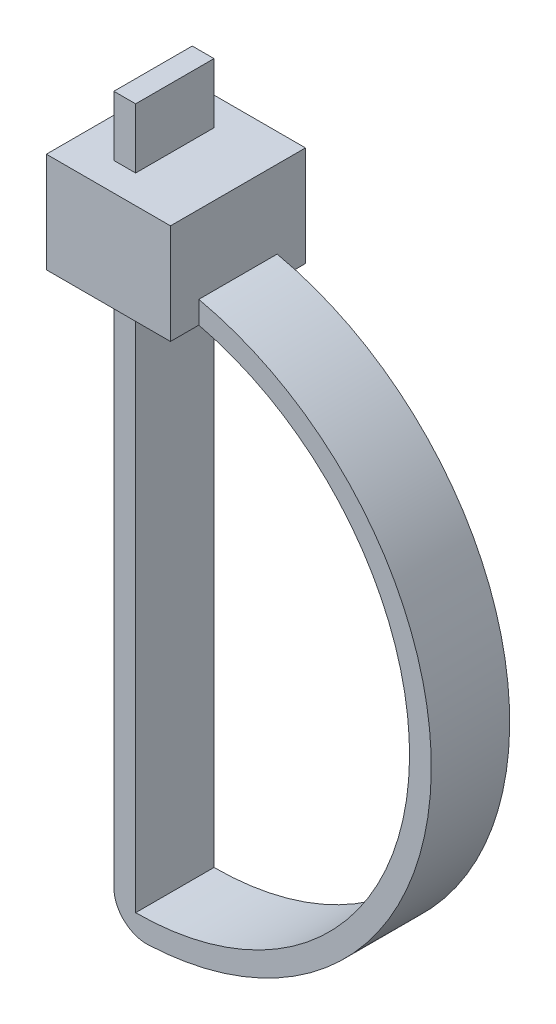
ISO-10303-21;
HEADER;
FILE_DESCRIPTION(('STEP AP214'),'2;1');
FILE_NAME('part.step','',(''),(''),'','','');
FILE_SCHEMA(('AUTOMOTIVE_DESIGN { 1 0 10303 214 1 1 1 1 }'));
ENDSEC;
DATA;
#1=APPLICATION_CONTEXT('core data for automotive mechanical design processes');
#2=APPLICATION_PROTOCOL_DEFINITION('international standard','automotive_design',2000,#1);
#3=PRODUCT_CONTEXT('',#1,'mechanical');
#4=PRODUCT('Part','Part','',(#3));
#5=PRODUCT_RELATED_PRODUCT_CATEGORY('part','',(#4));
#6=PRODUCT_DEFINITION_FORMATION('','',#4);
#7=PRODUCT_DEFINITION_CONTEXT('part definition',#1,'design');
#8=PRODUCT_DEFINITION('design','',#6,#7);
#9=PRODUCT_DEFINITION_SHAPE('','',#8);
#10=(LENGTH_UNIT() NAMED_UNIT(*) SI_UNIT(.MILLI.,.METRE.));
#11=(NAMED_UNIT(*) PLANE_ANGLE_UNIT() SI_UNIT($,.RADIAN.));
#12=(NAMED_UNIT(*) SI_UNIT($,.STERADIAN.) SOLID_ANGLE_UNIT());
#13=UNCERTAINTY_MEASURE_WITH_UNIT(LENGTH_MEASURE(1.E-05),#10,'distance_accuracy_value','');
#14=(GEOMETRIC_REPRESENTATION_CONTEXT(3) GLOBAL_UNCERTAINTY_ASSIGNED_CONTEXT((#13)) GLOBAL_UNIT_ASSIGNED_CONTEXT((#10,
#11,#12)) REPRESENTATION_CONTEXT('',''));
#15=CARTESIAN_POINT('',(0.,0.,0.));
#16=DIRECTION('',(0.,0.,1.));
#17=DIRECTION('',(1.,0.,0.));
#18=AXIS2_PLACEMENT_3D('',#15,#16,#17);
#19=CARTESIAN_POINT('',(-1.27,24.8841857478935,2.286));
#20=DIRECTION('',(0.,-1.,0.));
#21=DIRECTION('',(0.,0.,-1.));
#22=AXIS2_PLACEMENT_3D('',#19,#20,#21);
#23=PLANE('',#22);
#24=DIRECTION('',(0.,0.,-1.));
#25=VECTOR('',#24,1.);
#26=CARTESIAN_POINT('',(-1.27,24.8841857478935,2.286));
#27=LINE('',#26,#25);
#28=CARTESIAN_POINT('',(-1.27,24.8841857478935,-2.286));
#29=VERTEX_POINT('',#28);
#30=CARTESIAN_POINT('',(-1.27,24.8841857478935,2.286));
#31=VERTEX_POINT('',#30);
#32=EDGE_CURVE('E202',#29,#31,#27,.F.);
#33=ORIENTED_EDGE('',*,*,#32,.T.);
#34=DIRECTION('',(-1.,0.,0.));
#35=VECTOR('',#34,1.);
#36=CARTESIAN_POINT('',(0.,24.8841857478935,2.286));
#37=LINE('',#36,#35);
#38=CARTESIAN_POINT('',(0.,24.8841857478935,2.286));
#39=VERTEX_POINT('',#38);
#40=EDGE_CURVE('E240',#31,#39,#37,.F.);
#41=ORIENTED_EDGE('',*,*,#40,.T.);
#42=DIRECTION('',(0.,0.,1.));
#43=VECTOR('',#42,1.);
#44=CARTESIAN_POINT('',(0.,24.8841857478935,2.286));
#45=LINE('',#44,#43);
#46=CARTESIAN_POINT('',(0.,24.8841857478935,-2.286));
#47=VERTEX_POINT('',#46);
#48=EDGE_CURVE('E211',#39,#47,#45,.F.);
#49=ORIENTED_EDGE('',*,*,#48,.T.);
#50=DIRECTION('',(-1.,0.,0.));
#51=VECTOR('',#50,1.);
#52=CARTESIAN_POINT('',(0.,24.8841857478935,-2.286));
#53=LINE('',#52,#51);
#54=EDGE_CURVE('E214',#29,#47,#53,.F.);
#55=ORIENTED_EDGE('',*,*,#54,.F.);
#56=EDGE_LOOP('',(#33,#41,#49,#55));
#57=FACE_BOUND('',#56,.T.);
#58=ADVANCED_FACE('F17',(#57),#23,.F.);
#59=CARTESIAN_POINT('',(0.,0.,2.286));
#60=DIRECTION('',(0.,0.,-1.));
#61=DIRECTION('',(-1.,0.,0.));
#62=AXIS2_PLACEMENT_3D('',#59,#60,#61);
#63=PLANE('',#62);
#64=DIRECTION('',(-1.,0.,0.));
#65=VECTOR('',#64,1.);
#66=CARTESIAN_POINT('',(0.,21.388294045849,2.286));
#67=LINE('',#66,#65);
#68=CARTESIAN_POINT('',(0.,21.388294045849,2.286));
#69=VERTEX_POINT('',#68);
#70=CARTESIAN_POINT('',(-1.27,21.388294045849,2.286));
#71=VERTEX_POINT('',#70);
#72=EDGE_CURVE('E237',#69,#71,#67,.T.);
#73=ORIENTED_EDGE('',*,*,#72,.F.);
#74=DIRECTION('',(0.,1.,0.));
#75=VECTOR('',#74,1.);
#76=CARTESIAN_POINT('',(0.,18.0615659150551,2.286));
#77=LINE('',#76,#75);
#78=EDGE_CURVE('E205',#69,#39,#77,.T.);
#79=ORIENTED_EDGE('',*,*,#78,.T.);
#80=ORIENTED_EDGE('',*,*,#40,.F.);
#81=DIRECTION('',(0.,1.,0.));
#82=VECTOR('',#81,1.);
#83=CARTESIAN_POINT('',(-1.27,18.0615659150551,2.286));
#84=LINE('',#83,#82);
#85=EDGE_CURVE('E199',#31,#71,#84,.F.);
#86=ORIENTED_EDGE('',*,*,#85,.T.);
#87=EDGE_LOOP('',(#73,#79,#80,#86));
#88=FACE_BOUND('',#87,.T.);
#89=ADVANCED_FACE('F465',(#88),#63,.F.);
#90=CARTESIAN_POINT('',(0.,0.,-2.286));
#91=DIRECTION('',(0.,0.,-1.));
#92=DIRECTION('',(-1.,0.,0.));
#93=AXIS2_PLACEMENT_3D('',#90,#91,#92);
#94=PLANE('',#93);
#95=ORIENTED_EDGE('',*,*,#54,.T.);
#96=DIRECTION('',(0.,1.,0.));
#97=VECTOR('',#96,1.);
#98=CARTESIAN_POINT('',(0.,18.0615659150551,-2.286));
#99=LINE('',#98,#97);
#100=CARTESIAN_POINT('',(0.,21.388294045849,-2.286));
#101=VERTEX_POINT('',#100);
#102=EDGE_CURVE('E208',#47,#101,#99,.F.);
#103=ORIENTED_EDGE('',*,*,#102,.T.);
#104=DIRECTION('',(-1.,0.,0.));
#105=VECTOR('',#104,1.);
#106=CARTESIAN_POINT('',(0.,21.388294045849,-2.286));
#107=LINE('',#106,#105);
#108=CARTESIAN_POINT('',(-1.27,21.388294045849,-2.286));
#109=VERTEX_POINT('',#108);
#110=EDGE_CURVE('E234',#101,#109,#107,.T.);
#111=ORIENTED_EDGE('',*,*,#110,.T.);
#112=DIRECTION('',(0.,1.,0.));
#113=VECTOR('',#112,1.);
#114=CARTESIAN_POINT('',(-1.27,18.0615659150551,-2.286));
#115=LINE('',#114,#113);
#116=EDGE_CURVE('E196',#109,#29,#115,.T.);
#117=ORIENTED_EDGE('',*,*,#116,.T.);
#118=EDGE_LOOP('',(#95,#103,#111,#117));
#119=FACE_BOUND('',#118,.T.);
#120=ADVANCED_FACE('F455',(#119),#94,.T.);
#121=CARTESIAN_POINT('',(0.,18.0615659150551,2.286));
#122=DIRECTION('',(-1.,0.,0.));
#123=DIRECTION('',(0.,0.,1.));
#124=AXIS2_PLACEMENT_3D('',#121,#122,#123);
#125=PLANE('',#124);
#126=DIRECTION('',(0.,0.,-1.));
#127=VECTOR('',#126,1.);
#128=CARTESIAN_POINT('',(0.,21.388294045849,3.937));
#129=LINE('',#128,#127);
#130=EDGE_CURVE('E167',#69,#101,#129,.T.);
#131=ORIENTED_EDGE('',*,*,#130,.T.);
#132=ORIENTED_EDGE('',*,*,#102,.F.);
#133=ORIENTED_EDGE('',*,*,#48,.F.);
#134=ORIENTED_EDGE('',*,*,#78,.F.);
#135=EDGE_LOOP('',(#131,#132,#133,#134));
#136=FACE_BOUND('',#135,.T.);
#137=ADVANCED_FACE('F445',(#136),#125,.F.);
#138=CARTESIAN_POINT('',(-1.27,18.0615659150551,2.286));
#139=DIRECTION('',(1.,0.,0.));
#140=DIRECTION('',(0.,0.,-1.));
#141=AXIS2_PLACEMENT_3D('',#138,#139,#140);
#142=PLANE('',#141);
#143=DIRECTION('',(0.,0.,-1.));
#144=VECTOR('',#143,1.);
#145=CARTESIAN_POINT('',(-1.27,21.388294045849,3.937));
#146=LINE('',#145,#144);
#147=EDGE_CURVE('E164',#109,#71,#146,.F.);
#148=ORIENTED_EDGE('',*,*,#147,.T.);
#149=ORIENTED_EDGE('',*,*,#85,.F.);
#150=ORIENTED_EDGE('',*,*,#32,.F.);
#151=ORIENTED_EDGE('',*,*,#116,.F.);
#152=EDGE_LOOP('',(#148,#149,#150,#151));
#153=FACE_BOUND('',#152,.T.);
#154=ADVANCED_FACE('F436',(#153),#142,.F.);
#155=CARTESIAN_POINT('',(-3.556,15.546294045849,3.937));
#156=DIRECTION('',(1.,0.,0.));
#157=DIRECTION('',(0.,0.,-1.));
#158=AXIS2_PLACEMENT_3D('',#155,#156,#157);
#159=PLANE('',#158);
#160=DIRECTION('',(0.,0.,1.));
#161=VECTOR('',#160,1.);
#162=CARTESIAN_POINT('',(-3.556,15.546294045849,3.937));
#163=LINE('',#162,#161);
#164=CARTESIAN_POINT('',(-3.556,15.546294045849,-3.937));
#165=VERTEX_POINT('',#164);
#166=CARTESIAN_POINT('',(-3.556,15.546294045849,3.937));
#167=VERTEX_POINT('',#166);
#168=EDGE_CURVE('E103',#165,#167,#163,.T.);
#169=ORIENTED_EDGE('',*,*,#168,.T.);
#170=DIRECTION('',(0.,1.,0.));
#171=VECTOR('',#170,1.);
#172=CARTESIAN_POINT('',(-3.556,0.,3.937));
#173=LINE('',#172,#171);
#174=CARTESIAN_POINT('',(-3.556,21.388294045849,3.937));
#175=VERTEX_POINT('',#174);
#176=EDGE_CURVE('E176',#167,#175,#173,.T.);
#177=ORIENTED_EDGE('',*,*,#176,.T.);
#178=DIRECTION('',(0.,0.,-1.));
#179=VECTOR('',#178,1.);
#180=CARTESIAN_POINT('',(-3.556,21.388294045849,3.937));
#181=LINE('',#180,#179);
#182=CARTESIAN_POINT('',(-3.556,21.388294045849,-3.937));
#183=VERTEX_POINT('',#182);
#184=EDGE_CURVE('E170',#175,#183,#181,.T.);
#185=ORIENTED_EDGE('',*,*,#184,.T.);
#186=DIRECTION('',(0.,1.,0.));
#187=VECTOR('',#186,1.);
#188=CARTESIAN_POINT('',(-3.556,0.,-3.937));
#189=LINE('',#188,#187);
#190=EDGE_CURVE('E161',#165,#183,#189,.T.);
#191=ORIENTED_EDGE('',*,*,#190,.F.);
#192=EDGE_LOOP('',(#169,#177,#185,#191));
#193=FACE_BOUND('',#192,.T.);
#194=ADVANCED_FACE('F295',(#193),#159,.F.);
#195=CARTESIAN_POINT('',(0.635000000000004,15.3284528103785,2.286));
#196=DIRECTION('',(0.,0.,-1.));
#197=DIRECTION('',(-1.,0.,0.));
#198=AXIS2_PLACEMENT_3D('',#195,#196,#197);
#199=CYLINDRICAL_SURFACE('',#198,1.905);
#200=CARTESIAN_POINT('',(0.635000000000004,15.3284528103785,-2.286));
#201=DIRECTION('',(0.,0.,-1.));
#202=DIRECTION('',(-1.,0.,0.));
#203=AXIS2_PLACEMENT_3D('',#200,#201,#202);
#204=CIRCLE('',#203,1.905);
#205=CARTESIAN_POINT('',(-1.25750368457466,15.546294045849,-2.286));
#206=VERTEX_POINT('',#205);
#207=CARTESIAN_POINT('',(-1.27,15.3284528103785,-2.286));
#208=VERTEX_POINT('',#207);
#209=EDGE_CURVE('E101',#206,#208,#204,.F.);
#210=ORIENTED_EDGE('',*,*,#209,.T.);
#211=DIRECTION('',(0.,0.,-1.));
#212=VECTOR('',#211,1.);
#213=CARTESIAN_POINT('',(-1.27,15.3284528103785,2.286));
#214=LINE('',#213,#212);
#215=CARTESIAN_POINT('',(-1.27,15.3284528103785,2.286));
#216=VERTEX_POINT('',#215);
#217=EDGE_CURVE('E153',#208,#216,#214,.F.);
#218=ORIENTED_EDGE('',*,*,#217,.T.);
#219=CARTESIAN_POINT('',(0.635000000000004,15.3284528103785,2.286));
#220=DIRECTION('',(0.,0.,-1.));
#221=DIRECTION('',(-1.,0.,0.));
#222=AXIS2_PLACEMENT_3D('',#219,#220,#221);
#223=CIRCLE('',#222,1.905);
#224=CARTESIAN_POINT('',(-1.25750368457466,15.546294045849,2.286));
#225=VERTEX_POINT('',#224);
#226=EDGE_CURVE('E20',#216,#225,#223,.T.);
#227=ORIENTED_EDGE('',*,*,#226,.T.);
#228=DIRECTION('',(0.,0.,1.));
#229=VECTOR('',#228,1.);
#230=CARTESIAN_POINT('',(-1.25750368457466,15.546294045849,3.937));
#231=LINE('',#230,#229);
#232=EDGE_CURVE('E104',#225,#206,#231,.F.);
#233=ORIENTED_EDGE('',*,*,#232,.T.);
#234=EDGE_LOOP('',(#210,#218,#227,#233));
#235=FACE_BOUND('',#234,.T.);
#236=ADVANCED_FACE('F251',(#235),#199,.T.);
#237=CARTESIAN_POINT('',(-3.556,15.546294045849,3.937));
#238=DIRECTION('',(0.,1.,0.));
#239=DIRECTION('',(0.,0.,1.));
#240=AXIS2_PLACEMENT_3D('',#237,#238,#239);
#241=PLANE('',#240);
#242=DIRECTION('',(0.,0.,1.));
#243=VECTOR('',#242,1.);
#244=CARTESIAN_POINT('',(3.683,15.546294045849,3.937));
#245=LINE('',#244,#243);
#246=CARTESIAN_POINT('',(3.683,15.546294045849,-2.286));
#247=VERTEX_POINT('',#246);
#248=CARTESIAN_POINT('',(3.683,15.546294045849,-3.937));
#249=VERTEX_POINT('',#248);
#250=EDGE_CURVE('E188',#247,#249,#245,.F.);
#251=ORIENTED_EDGE('',*,*,#250,.F.);
#252=DIRECTION('',(0.,0.,-1.));
#253=VECTOR('',#252,1.);
#254=CARTESIAN_POINT('',(3.683,15.546294045849,2.286));
#255=LINE('',#254,#253);
#256=CARTESIAN_POINT('',(3.683,15.546294045849,2.286));
#257=VERTEX_POINT('',#256);
#258=EDGE_CURVE('E112',#247,#257,#255,.F.);
#259=ORIENTED_EDGE('',*,*,#258,.T.);
#260=DIRECTION('',(0.,0.,1.));
#261=VECTOR('',#260,1.);
#262=CARTESIAN_POINT('',(3.683,15.546294045849,3.937));
#263=LINE('',#262,#261);
#264=CARTESIAN_POINT('',(3.683,15.546294045849,3.937));
#265=VERTEX_POINT('',#264);
#266=EDGE_CURVE('E181',#265,#257,#263,.F.);
#267=ORIENTED_EDGE('',*,*,#266,.F.);
#268=DIRECTION('',(-1.,0.,0.));
#269=VECTOR('',#268,1.);
#270=CARTESIAN_POINT('',(0.,15.546294045849,3.937));
#271=LINE('',#270,#269);
#272=EDGE_CURVE('E179',#265,#167,#271,.T.);
#273=ORIENTED_EDGE('',*,*,#272,.T.);
#274=ORIENTED_EDGE('',*,*,#168,.F.);
#275=DIRECTION('',(-1.,0.,0.));
#276=VECTOR('',#275,1.);
#277=CARTESIAN_POINT('',(0.,15.546294045849,-3.937));
#278=LINE('',#277,#276);
#279=EDGE_CURVE('E157',#249,#165,#278,.T.);
#280=ORIENTED_EDGE('',*,*,#279,.F.);
#281=EDGE_LOOP('',(#251,#259,#267,#273,#274,#280));
#282=FACE_BOUND('',#281,.T.);
#283=DIRECTION('',(1.,0.,0.));
#284=VECTOR('',#283,1.);
#285=CARTESIAN_POINT('',(-3.556,15.546294045849,-2.286));
#286=LINE('',#285,#284);
#287=CARTESIAN_POINT('',(0.,15.546294045849,-2.286));
#288=VERTEX_POINT('',#287);
#289=EDGE_CURVE('E96',#206,#288,#286,.T.);
#290=ORIENTED_EDGE('',*,*,#289,.F.);
#291=ORIENTED_EDGE('',*,*,#232,.F.);
#292=DIRECTION('',(1.,0.,0.));
#293=VECTOR('',#292,1.);
#294=CARTESIAN_POINT('',(-3.556,15.546294045849,2.286));
#295=LINE('',#294,#293);
#296=CARTESIAN_POINT('',(0.,15.546294045849,2.286));
#297=VERTEX_POINT('',#296);
#298=EDGE_CURVE('E72',#297,#225,#295,.F.);
#299=ORIENTED_EDGE('',*,*,#298,.F.);
#300=DIRECTION('',(0.,0.,-1.));
#301=VECTOR('',#300,1.);
#302=CARTESIAN_POINT('',(0.,15.546294045849,2.286));
#303=LINE('',#302,#301);
#304=EDGE_CURVE('E106',#288,#297,#303,.F.);
#305=ORIENTED_EDGE('',*,*,#304,.F.);
#306=EDGE_LOOP('',(#290,#291,#299,#305));
#307=FACE_BOUND('',#306,.T.);
#308=ADVANCED_FACE('F107',(#282,#307),#241,.F.);
#309=CARTESIAN_POINT('',(0.,0.,3.937));
#310=DIRECTION('',(0.,0.,-1.));
#311=DIRECTION('',(-1.,0.,0.));
#312=AXIS2_PLACEMENT_3D('',#309,#310,#311);
#313=PLANE('',#312);
#314=ORIENTED_EDGE('',*,*,#272,.F.);
#315=DIRECTION('',(0.,1.,0.));
#316=VECTOR('',#315,1.);
#317=CARTESIAN_POINT('',(3.683,15.546294045849,3.937));
#318=LINE('',#317,#316);
#319=CARTESIAN_POINT('',(3.683,21.388294045849,3.937));
#320=VERTEX_POINT('',#319);
#321=EDGE_CURVE('E147',#265,#320,#318,.T.);
#322=ORIENTED_EDGE('',*,*,#321,.T.);
#323=DIRECTION('',(1.,0.,0.));
#324=VECTOR('',#323,1.);
#325=CARTESIAN_POINT('',(-3.556,21.388294045849,3.937));
#326=LINE('',#325,#324);
#327=EDGE_CURVE('E173',#320,#175,#326,.F.);
#328=ORIENTED_EDGE('',*,*,#327,.T.);
#329=ORIENTED_EDGE('',*,*,#176,.F.);
#330=EDGE_LOOP('',(#314,#322,#328,#329));
#331=FACE_BOUND('',#330,.T.);
#332=ADVANCED_FACE('F300',(#331),#313,.F.);
#333=CARTESIAN_POINT('',(-3.556,21.388294045849,3.937));
#334=DIRECTION('',(0.,-1.,0.));
#335=DIRECTION('',(0.,0.,-1.));
#336=AXIS2_PLACEMENT_3D('',#333,#334,#335);
#337=PLANE('',#336);
#338=ORIENTED_EDGE('',*,*,#147,.F.);
#339=ORIENTED_EDGE('',*,*,#110,.F.);
#340=ORIENTED_EDGE('',*,*,#130,.F.);
#341=ORIENTED_EDGE('',*,*,#72,.T.);
#342=EDGE_LOOP('',(#338,#339,#340,#341));
#343=FACE_BOUND('',#342,.T.);
#344=ORIENTED_EDGE('',*,*,#184,.F.);
#345=ORIENTED_EDGE('',*,*,#327,.F.);
#346=DIRECTION('',(0.,0.,1.));
#347=VECTOR('',#346,1.);
#348=CARTESIAN_POINT('',(3.683,21.388294045849,3.937));
#349=LINE('',#348,#347);
#350=CARTESIAN_POINT('',(3.683,21.388294045849,-3.937));
#351=VERTEX_POINT('',#350);
#352=EDGE_CURVE('E144',#320,#351,#349,.F.);
#353=ORIENTED_EDGE('',*,*,#352,.T.);
#354=DIRECTION('',(-1.,0.,0.));
#355=VECTOR('',#354,1.);
#356=CARTESIAN_POINT('',(0.,21.388294045849,-3.937));
#357=LINE('',#356,#355);
#358=EDGE_CURVE('E158',#183,#351,#357,.F.);
#359=ORIENTED_EDGE('',*,*,#358,.F.);
#360=EDGE_LOOP('',(#344,#345,#353,#359));
#361=FACE_BOUND('',#360,.T.);
#362=ADVANCED_FACE('F304',(#343,#361),#337,.F.);
#363=CARTESIAN_POINT('',(0.,0.,-3.937));
#364=DIRECTION('',(0.,0.,-1.));
#365=DIRECTION('',(-1.,0.,0.));
#366=AXIS2_PLACEMENT_3D('',#363,#364,#365);
#367=PLANE('',#366);
#368=DIRECTION('',(0.,1.,0.));
#369=VECTOR('',#368,1.);
#370=CARTESIAN_POINT('',(3.683,15.546294045849,-3.937));
#371=LINE('',#370,#369);
#372=EDGE_CURVE('E141',#351,#249,#371,.F.);
#373=ORIENTED_EDGE('',*,*,#372,.T.);
#374=ORIENTED_EDGE('',*,*,#279,.T.);
#375=ORIENTED_EDGE('',*,*,#190,.T.);
#376=ORIENTED_EDGE('',*,*,#358,.T.);
#377=EDGE_LOOP('',(#373,#374,#375,#376));
#378=FACE_BOUND('',#377,.T.);
#379=ADVANCED_FACE('F307',(#378),#367,.T.);
#380=CARTESIAN_POINT('',(-1.27,0.,2.286));
#381=DIRECTION('',(1.,0.,0.));
#382=DIRECTION('',(0.,0.,-1.));
#383=AXIS2_PLACEMENT_3D('',#380,#381,#382);
#384=PLANE('',#383);
#385=DIRECTION('',(0.,0.,-1.));
#386=VECTOR('',#385,1.);
#387=CARTESIAN_POINT('',(-1.27,-15.3284528103785,2.286));
#388=LINE('',#387,#386);
#389=CARTESIAN_POINT('',(-1.27,-15.3284528103785,2.286));
#390=VERTEX_POINT('',#389);
#391=CARTESIAN_POINT('',(-1.27,-15.3284528103785,-2.286));
#392=VERTEX_POINT('',#391);
#393=EDGE_CURVE('E130',#390,#392,#388,.T.);
#394=ORIENTED_EDGE('',*,*,#393,.F.);
#395=DIRECTION('',(0.,1.,0.));
#396=VECTOR('',#395,1.);
#397=CARTESIAN_POINT('',(-1.27,0.,2.286));
#398=LINE('',#397,#396);
#399=EDGE_CURVE('E137',#216,#390,#398,.F.);
#400=ORIENTED_EDGE('',*,*,#399,.F.);
#401=ORIENTED_EDGE('',*,*,#217,.F.);
#402=DIRECTION('',(0.,1.,0.));
#403=VECTOR('',#402,1.);
#404=CARTESIAN_POINT('',(-1.27,0.,-2.286));
#405=LINE('',#404,#403);
#406=EDGE_CURVE('E127',#208,#392,#405,.F.);
#407=ORIENTED_EDGE('',*,*,#406,.T.);
#408=EDGE_LOOP('',(#394,#400,#401,#407));
#409=FACE_BOUND('',#408,.T.);
#410=ADVANCED_FACE('F320',(#409),#384,.F.);
#411=CARTESIAN_POINT('',(0.,0.,2.286));
#412=DIRECTION('',(0.,0.,-1.));
#413=DIRECTION('',(-1.,0.,0.));
#414=AXIS2_PLACEMENT_3D('',#411,#412,#413);
#415=CYLINDRICAL_SURFACE('',#414,15.9766);
#416=ORIENTED_EDGE('',*,*,#258,.F.);
#417=CARTESIAN_POINT('',(0.,0.,-2.286));
#418=DIRECTION('',(0.,0.,-1.));
#419=DIRECTION('',(-1.,0.,0.));
#420=AXIS2_PLACEMENT_3D('',#417,#418,#419);
#421=CIRCLE('',#420,15.9766);
#422=CARTESIAN_POINT('',(0.,-15.9766,-2.286));
#423=VERTEX_POINT('',#422);
#424=EDGE_CURVE('E90',#247,#423,#421,.T.);
#425=ORIENTED_EDGE('',*,*,#424,.T.);
#426=DIRECTION('',(0.,0.,-1.));
#427=VECTOR('',#426,1.);
#428=CARTESIAN_POINT('',(0.,-15.9766,2.286));
#429=LINE('',#428,#427);
#430=CARTESIAN_POINT('',(0.,-15.9766,2.286));
#431=VERTEX_POINT('',#430);
#432=EDGE_CURVE('E111',#431,#423,#429,.T.);
#433=ORIENTED_EDGE('',*,*,#432,.F.);
#434=CARTESIAN_POINT('',(0.,0.,2.286));
#435=DIRECTION('',(0.,0.,-1.));
#436=DIRECTION('',(-1.,0.,0.));
#437=AXIS2_PLACEMENT_3D('',#434,#435,#436);
#438=CIRCLE('',#437,15.9766);
#439=EDGE_CURVE('E136',#257,#431,#438,.T.);
#440=ORIENTED_EDGE('',*,*,#439,.F.);
#441=EDGE_LOOP('',(#416,#425,#433,#440));
#442=FACE_BOUND('',#441,.T.);
#443=ADVANCED_FACE('F312',(#442),#415,.F.);
#444=CARTESIAN_POINT('',(0.,0.,2.286));
#445=DIRECTION('',(1.,0.,0.));
#446=DIRECTION('',(0.,0.,-1.));
#447=AXIS2_PLACEMENT_3D('',#444,#445,#446);
#448=PLANE('',#447);
#449=DIRECTION('',(0.,1.,0.));
#450=VECTOR('',#449,1.);
#451=CARTESIAN_POINT('',(0.,0.,2.286));
#452=LINE('',#451,#450);
#453=EDGE_CURVE('E139',#431,#297,#452,.T.);
#454=ORIENTED_EDGE('',*,*,#453,.F.);
#455=ORIENTED_EDGE('',*,*,#432,.T.);
#456=DIRECTION('',(0.,1.,0.));
#457=VECTOR('',#456,1.);
#458=CARTESIAN_POINT('',(0.,0.,-2.286));
#459=LINE('',#458,#457);
#460=EDGE_CURVE('E99',#423,#288,#459,.T.);
#461=ORIENTED_EDGE('',*,*,#460,.T.);
#462=ORIENTED_EDGE('',*,*,#304,.T.);
#463=EDGE_LOOP('',(#454,#455,#461,#462));
#464=FACE_BOUND('',#463,.T.);
#465=ADVANCED_FACE('F114',(#464),#448,.T.);
#466=CARTESIAN_POINT('',(3.683,15.546294045849,3.937));
#467=DIRECTION('',(-1.,0.,0.));
#468=DIRECTION('',(0.,0.,1.));
#469=AXIS2_PLACEMENT_3D('',#466,#467,#468);
#470=PLANE('',#469);
#471=DIRECTION('',(0.,0.,-1.));
#472=VECTOR('',#471,1.);
#473=CARTESIAN_POINT('',(3.683,16.8487602677467,2.286));
#474=LINE('',#473,#472);
#475=CARTESIAN_POINT('',(3.683,16.8487602677467,-2.286));
#476=VERTEX_POINT('',#475);
#477=CARTESIAN_POINT('',(3.683,16.8487602677467,2.286));
#478=VERTEX_POINT('',#477);
#479=EDGE_CURVE('E115',#476,#478,#474,.F.);
#480=ORIENTED_EDGE('',*,*,#479,.F.);
#481=DIRECTION('',(0.,1.,0.));
#482=VECTOR('',#481,1.);
#483=CARTESIAN_POINT('',(3.683,0.,-2.286));
#484=LINE('',#483,#482);
#485=EDGE_CURVE('E120',#476,#247,#484,.F.);
#486=ORIENTED_EDGE('',*,*,#485,.T.);
#487=ORIENTED_EDGE('',*,*,#250,.T.);
#488=ORIENTED_EDGE('',*,*,#372,.F.);
#489=ORIENTED_EDGE('',*,*,#352,.F.);
#490=ORIENTED_EDGE('',*,*,#321,.F.);
#491=ORIENTED_EDGE('',*,*,#266,.T.);
#492=DIRECTION('',(0.,1.,0.));
#493=VECTOR('',#492,1.);
#494=CARTESIAN_POINT('',(3.683,0.,2.286));
#495=LINE('',#494,#493);
#496=EDGE_CURVE('E133',#478,#257,#495,.F.);
#497=ORIENTED_EDGE('',*,*,#496,.F.);
#498=EDGE_LOOP('',(#480,#486,#487,#488,#489,#490,#491,#497));
#499=FACE_BOUND('',#498,.T.);
#500=ADVANCED_FACE('F311',(#499),#470,.F.);
#501=CARTESIAN_POINT('',(0.,0.,2.286));
#502=DIRECTION('',(0.,0.,1.));
#503=DIRECTION('',(1.,0.,0.));
#504=AXIS2_PLACEMENT_3D('',#501,#502,#503);
#505=PLANE('',#504);
#506=ORIENTED_EDGE('',*,*,#496,.T.);
#507=ORIENTED_EDGE('',*,*,#439,.T.);
#508=ORIENTED_EDGE('',*,*,#453,.T.);
#509=ORIENTED_EDGE('',*,*,#298,.T.);
#510=ORIENTED_EDGE('',*,*,#226,.F.);
#511=ORIENTED_EDGE('',*,*,#399,.T.);
#512=CARTESIAN_POINT('',(0.635000000000004,-15.3284528103785,2.286));
#513=DIRECTION('',(0.,0.,-1.));
#514=DIRECTION('',(-1.,0.,0.));
#515=AXIS2_PLACEMENT_3D('',#512,#513,#514);
#516=CIRCLE('',#515,1.905);
#517=CARTESIAN_POINT('',(0.713849337748352,-17.2318202951109,2.286));
#518=VERTEX_POINT('',#517);
#519=EDGE_CURVE('E155',#518,#390,#516,.T.);
#520=ORIENTED_EDGE('',*,*,#519,.F.);
#521=CARTESIAN_POINT('',(0.,0.,2.286));
#522=DIRECTION('',(0.,0.,-1.));
#523=DIRECTION('',(-1.,0.,0.));
#524=AXIS2_PLACEMENT_3D('',#521,#522,#523);
#525=CIRCLE('',#524,17.2466);
#526=EDGE_CURVE('E118',#478,#518,#525,.T.);
#527=ORIENTED_EDGE('',*,*,#526,.F.);
#528=EDGE_LOOP('',(#506,#507,#508,#509,#510,#511,#520,#527));
#529=FACE_BOUND('',#528,.T.);
#530=ADVANCED_FACE('F314',(#529),#505,.T.);
#531=CARTESIAN_POINT('',(0.635000000000004,-15.3284528103785,2.286));
#532=DIRECTION('',(0.,0.,-1.));
#533=DIRECTION('',(-1.,0.,0.));
#534=AXIS2_PLACEMENT_3D('',#531,#532,#533);
#535=CYLINDRICAL_SURFACE('',#534,1.905);
#536=CARTESIAN_POINT('',(0.635000000000004,-15.3284528103785,-2.286));
#537=DIRECTION('',(0.,0.,-1.));
#538=DIRECTION('',(-1.,0.,0.));
#539=AXIS2_PLACEMENT_3D('',#536,#537,#538);
#540=CIRCLE('',#539,1.905);
#541=CARTESIAN_POINT('',(0.713849337748352,-17.2318202951109,-2.286));
#542=VERTEX_POINT('',#541);
#543=EDGE_CURVE('E35',#392,#542,#540,.F.);
#544=ORIENTED_EDGE('',*,*,#543,.T.);
#545=DIRECTION('',(0.,0.,-1.));
#546=VECTOR('',#545,1.);
#547=CARTESIAN_POINT('',(0.713849337748356,-17.2318202951109,2.286));
#548=LINE('',#547,#546);
#549=EDGE_CURVE('E26',#518,#542,#548,.T.);
#550=ORIENTED_EDGE('',*,*,#549,.F.);
#551=ORIENTED_EDGE('',*,*,#519,.T.);
#552=ORIENTED_EDGE('',*,*,#393,.T.);
#553=EDGE_LOOP('',(#544,#550,#551,#552));
#554=FACE_BOUND('',#553,.T.);
#555=ADVANCED_FACE('F321',(#554),#535,.T.);
#556=CARTESIAN_POINT('',(0.,0.,-2.286));
#557=DIRECTION('',(0.,0.,1.));
#558=DIRECTION('',(1.,0.,0.));
#559=AXIS2_PLACEMENT_3D('',#556,#557,#558);
#560=PLANE('',#559);
#561=ORIENTED_EDGE('',*,*,#460,.F.);
#562=ORIENTED_EDGE('',*,*,#424,.F.);
#563=ORIENTED_EDGE('',*,*,#485,.F.);
#564=CARTESIAN_POINT('',(0.,0.,-2.286));
#565=DIRECTION('',(0.,0.,-1.));
#566=DIRECTION('',(-1.,0.,0.));
#567=AXIS2_PLACEMENT_3D('',#564,#565,#566);
#568=CIRCLE('',#567,17.2466);
#569=EDGE_CURVE('E11',#542,#476,#568,.F.);
#570=ORIENTED_EDGE('',*,*,#569,.F.);
#571=ORIENTED_EDGE('',*,*,#543,.F.);
#572=ORIENTED_EDGE('',*,*,#406,.F.);
#573=ORIENTED_EDGE('',*,*,#209,.F.);
#574=ORIENTED_EDGE('',*,*,#289,.T.);
#575=EDGE_LOOP('',(#561,#562,#563,#570,#571,#572,#573,#574));
#576=FACE_BOUND('',#575,.T.);
#577=ADVANCED_FACE('F97',(#576),#560,.F.);
#578=CARTESIAN_POINT('',(0.,0.,2.286));
#579=DIRECTION('',(0.,0.,-1.));
#580=DIRECTION('',(-1.,0.,0.));
#581=AXIS2_PLACEMENT_3D('',#578,#579,#580);
#582=CYLINDRICAL_SURFACE('',#581,17.2466);
#583=ORIENTED_EDGE('',*,*,#549,.T.);
#584=ORIENTED_EDGE('',*,*,#569,.T.);
#585=ORIENTED_EDGE('',*,*,#479,.T.);
#586=ORIENTED_EDGE('',*,*,#526,.T.);
#587=EDGE_LOOP('',(#583,#584,#585,#586));
#588=FACE_BOUND('',#587,.T.);
#589=ADVANCED_FACE('F317',(#588),#582,.T.);
#590=CLOSED_SHELL('',(#58,#89,#120,#137,#154,#194,#236,#308,#332,#362,#379,#410,#443,#465,#500,
#530,#555,#577,#589));
#591=MANIFOLD_SOLID_BREP('B1',#590);
#592=ADVANCED_BREP_SHAPE_REPRESENTATION('',(#18,#591),#14);
#593=SHAPE_DEFINITION_REPRESENTATION(#9,#592);
ENDSEC;
END-ISO-10303-21;
